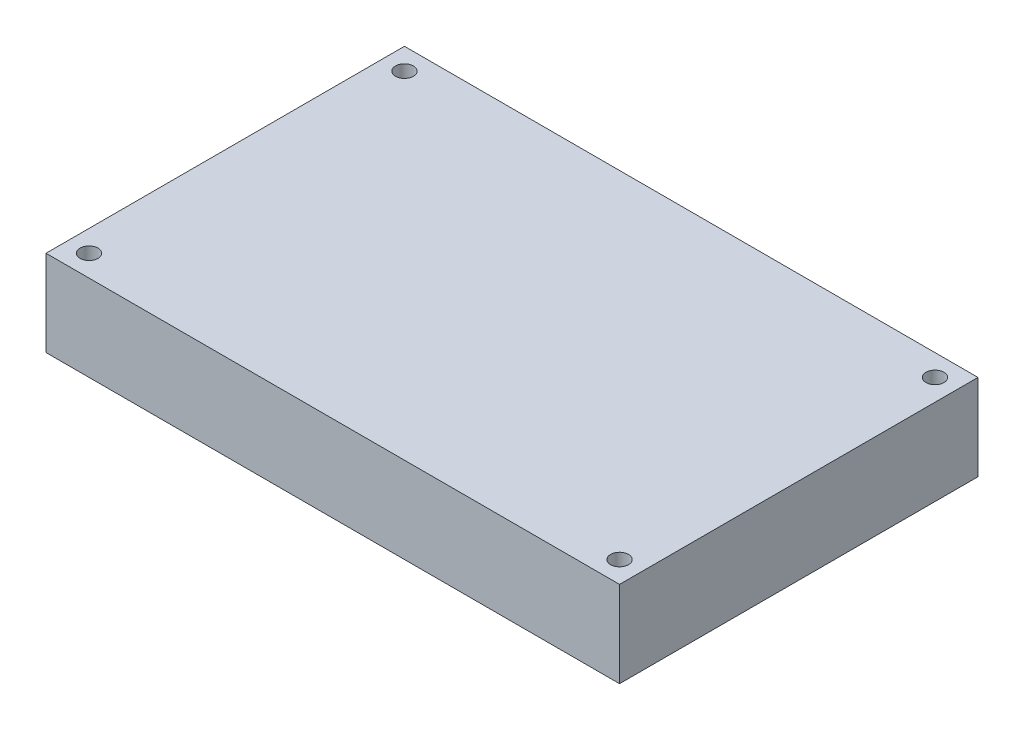
ISO-10303-21;
HEADER;
FILE_DESCRIPTION(('STEP AP214'),'2;1');
FILE_NAME('part.step','',(''),(''),'','','');
FILE_SCHEMA(('AUTOMOTIVE_DESIGN { 1 0 10303 214 1 1 1 1 }'));
ENDSEC;
DATA;
#1=APPLICATION_CONTEXT('core data for automotive mechanical design processes');
#2=APPLICATION_PROTOCOL_DEFINITION('international standard','automotive_design',2000,#1);
#3=PRODUCT_CONTEXT('',#1,'mechanical');
#4=PRODUCT('Part','Part','',(#3));
#5=PRODUCT_RELATED_PRODUCT_CATEGORY('part','',(#4));
#6=PRODUCT_DEFINITION_FORMATION('','',#4);
#7=PRODUCT_DEFINITION_CONTEXT('part definition',#1,'design');
#8=PRODUCT_DEFINITION('design','',#6,#7);
#9=PRODUCT_DEFINITION_SHAPE('','',#8);
#10=(LENGTH_UNIT() NAMED_UNIT(*) SI_UNIT(.MILLI.,.METRE.));
#11=(NAMED_UNIT(*) PLANE_ANGLE_UNIT() SI_UNIT($,.RADIAN.));
#12=(NAMED_UNIT(*) SI_UNIT($,.STERADIAN.) SOLID_ANGLE_UNIT());
#13=UNCERTAINTY_MEASURE_WITH_UNIT(LENGTH_MEASURE(1.E-05),#10,'distance_accuracy_value','');
#14=(GEOMETRIC_REPRESENTATION_CONTEXT(3) GLOBAL_UNCERTAINTY_ASSIGNED_CONTEXT((#13)) GLOBAL_UNIT_ASSIGNED_CONTEXT((#10,
#11,#12)) REPRESENTATION_CONTEXT('',''));
#15=CARTESIAN_POINT('',(0.,0.,0.));
#16=DIRECTION('',(0.,0.,1.));
#17=DIRECTION('',(1.,0.,0.));
#18=AXIS2_PLACEMENT_3D('',#15,#16,#17);
#19=CARTESIAN_POINT('',(0.,12.,0.));
#20=DIRECTION('',(0.,1.,0.));
#21=DIRECTION('',(0.,0.,1.));
#22=AXIS2_PLACEMENT_3D('',#19,#20,#21);
#23=PLANE('',#22);
#24=CARTESIAN_POINT('',(37.,12.,22.));
#25=DIRECTION('',(0.,1.,0.));
#26=DIRECTION('',(0.,0.,1.));
#27=AXIS2_PLACEMENT_3D('',#24,#25,#26);
#28=CIRCLE('',#27,1.25);
#29=CARTESIAN_POINT('',(37.,12.,23.25));
#30=VERTEX_POINT('',#29);
#31=EDGE_CURVE('E156',#30,#30,#28,.T.);
#32=ORIENTED_EDGE('',*,*,#31,.F.);
#33=EDGE_LOOP('',(#32));
#34=FACE_BOUND('',#33,.T.);
#35=CARTESIAN_POINT('',(-37.,12.,-22.));
#36=DIRECTION('',(0.,1.,0.));
#37=DIRECTION('',(0.,0.,1.));
#38=AXIS2_PLACEMENT_3D('',#35,#36,#37);
#39=CIRCLE('',#38,1.25);
#40=CARTESIAN_POINT('',(-37.,12.,-20.75));
#41=VERTEX_POINT('',#40);
#42=EDGE_CURVE('E125',#41,#41,#39,.T.);
#43=ORIENTED_EDGE('',*,*,#42,.F.);
#44=EDGE_LOOP('',(#43));
#45=FACE_BOUND('',#44,.T.);
#46=DIRECTION('',(0.,0.,-1.));
#47=VECTOR('',#46,1.);
#48=CARTESIAN_POINT('',(40.,12.,-25.));
#49=LINE('',#48,#47);
#50=CARTESIAN_POINT('',(40.,12.,25.));
#51=VERTEX_POINT('',#50);
#52=CARTESIAN_POINT('',(40.,12.,-25.));
#53=VERTEX_POINT('',#52);
#54=EDGE_CURVE('E104',#51,#53,#49,.T.);
#55=ORIENTED_EDGE('',*,*,#54,.T.);
#56=DIRECTION('',(-1.,0.,0.));
#57=VECTOR('',#56,1.);
#58=CARTESIAN_POINT('',(-40.,12.,-25.));
#59=LINE('',#58,#57);
#60=CARTESIAN_POINT('',(-40.,12.,-25.));
#61=VERTEX_POINT('',#60);
#62=EDGE_CURVE('E99',#53,#61,#59,.T.);
#63=ORIENTED_EDGE('',*,*,#62,.T.);
#64=DIRECTION('',(0.,0.,1.));
#65=VECTOR('',#64,1.);
#66=CARTESIAN_POINT('',(-40.,12.,-25.));
#67=LINE('',#66,#65);
#68=CARTESIAN_POINT('',(-40.,12.,25.));
#69=VERTEX_POINT('',#68);
#70=EDGE_CURVE('E102',#61,#69,#67,.T.);
#71=ORIENTED_EDGE('',*,*,#70,.T.);
#72=DIRECTION('',(1.,0.,0.));
#73=VECTOR('',#72,1.);
#74=CARTESIAN_POINT('',(-40.,12.,25.));
#75=LINE('',#74,#73);
#76=EDGE_CURVE('E64',#69,#51,#75,.T.);
#77=ORIENTED_EDGE('',*,*,#76,.T.);
#78=EDGE_LOOP('',(#55,#63,#71,#77));
#79=FACE_BOUND('',#78,.T.);
#80=CARTESIAN_POINT('',(37.,12.,-22.));
#81=DIRECTION('',(0.,1.,0.));
#82=DIRECTION('',(0.,0.,1.));
#83=AXIS2_PLACEMENT_3D('',#80,#81,#82);
#84=CIRCLE('',#83,1.25);
#85=CARTESIAN_POINT('',(37.,12.,-20.75));
#86=VERTEX_POINT('',#85);
#87=EDGE_CURVE('E149',#86,#86,#84,.T.);
#88=ORIENTED_EDGE('',*,*,#87,.F.);
#89=EDGE_LOOP('',(#88));
#90=FACE_BOUND('',#89,.T.);
#91=CARTESIAN_POINT('',(-37.,12.,22.));
#92=DIRECTION('',(0.,1.,0.));
#93=DIRECTION('',(0.,0.,1.));
#94=AXIS2_PLACEMENT_3D('',#91,#92,#93);
#95=CIRCLE('',#94,1.25);
#96=CARTESIAN_POINT('',(-37.,12.,23.25));
#97=VERTEX_POINT('',#96);
#98=EDGE_CURVE('E163',#97,#97,#95,.T.);
#99=ORIENTED_EDGE('',*,*,#98,.F.);
#100=EDGE_LOOP('',(#99));
#101=FACE_BOUND('',#100,.T.);
#102=ADVANCED_FACE('F43',(#34,#45,#79,#90,#101),#23,.T.);
#103=CARTESIAN_POINT('',(0.,0.,0.));
#104=DIRECTION('',(0.,1.,0.));
#105=DIRECTION('',(0.,0.,1.));
#106=AXIS2_PLACEMENT_3D('',#103,#104,#105);
#107=PLANE('',#106);
#108=DIRECTION('',(0.,0.,-1.));
#109=VECTOR('',#108,1.);
#110=CARTESIAN_POINT('',(40.,0.,-25.));
#111=LINE('',#110,#109);
#112=CARTESIAN_POINT('',(40.,0.,25.));
#113=VERTEX_POINT('',#112);
#114=CARTESIAN_POINT('',(40.,0.,-25.));
#115=VERTEX_POINT('',#114);
#116=EDGE_CURVE('E121',#113,#115,#111,.T.);
#117=ORIENTED_EDGE('',*,*,#116,.F.);
#118=DIRECTION('',(1.,0.,0.));
#119=VECTOR('',#118,1.);
#120=CARTESIAN_POINT('',(-40.,0.,25.));
#121=LINE('',#120,#119);
#122=CARTESIAN_POINT('',(-40.,0.,25.));
#123=VERTEX_POINT('',#122);
#124=EDGE_CURVE('E91',#123,#113,#121,.T.);
#125=ORIENTED_EDGE('',*,*,#124,.F.);
#126=DIRECTION('',(0.,0.,1.));
#127=VECTOR('',#126,1.);
#128=CARTESIAN_POINT('',(-40.,0.,-25.));
#129=LINE('',#128,#127);
#130=CARTESIAN_POINT('',(-40.,0.,-25.));
#131=VERTEX_POINT('',#130);
#132=EDGE_CURVE('E84',#131,#123,#129,.T.);
#133=ORIENTED_EDGE('',*,*,#132,.F.);
#134=DIRECTION('',(-1.,0.,0.));
#135=VECTOR('',#134,1.);
#136=CARTESIAN_POINT('',(-40.,0.,-25.));
#137=LINE('',#136,#135);
#138=EDGE_CURVE('E109',#115,#131,#137,.T.);
#139=ORIENTED_EDGE('',*,*,#138,.F.);
#140=EDGE_LOOP('',(#117,#125,#133,#139));
#141=FACE_BOUND('',#140,.T.);
#142=CARTESIAN_POINT('',(-37.,0.,-22.));
#143=DIRECTION('',(0.,1.,0.));
#144=DIRECTION('',(0.,0.,1.));
#145=AXIS2_PLACEMENT_3D('',#142,#143,#144);
#146=CIRCLE('',#145,1.25);
#147=CARTESIAN_POINT('',(-37.,0.,-20.75));
#148=VERTEX_POINT('',#147);
#149=EDGE_CURVE('E145',#148,#148,#146,.T.);
#150=ORIENTED_EDGE('',*,*,#149,.T.);
#151=EDGE_LOOP('',(#150));
#152=FACE_BOUND('',#151,.T.);
#153=CARTESIAN_POINT('',(37.,0.,-22.));
#154=DIRECTION('',(0.,1.,0.));
#155=DIRECTION('',(0.,0.,1.));
#156=AXIS2_PLACEMENT_3D('',#153,#154,#155);
#157=CIRCLE('',#156,1.25);
#158=CARTESIAN_POINT('',(37.,0.,-20.75));
#159=VERTEX_POINT('',#158);
#160=EDGE_CURVE('E153',#159,#159,#157,.T.);
#161=ORIENTED_EDGE('',*,*,#160,.T.);
#162=EDGE_LOOP('',(#161));
#163=FACE_BOUND('',#162,.T.);
#164=CARTESIAN_POINT('',(37.,0.,22.));
#165=DIRECTION('',(0.,1.,0.));
#166=DIRECTION('',(0.,0.,1.));
#167=AXIS2_PLACEMENT_3D('',#164,#165,#166);
#168=CIRCLE('',#167,1.25);
#169=CARTESIAN_POINT('',(37.,0.,23.25));
#170=VERTEX_POINT('',#169);
#171=EDGE_CURVE('E160',#170,#170,#168,.T.);
#172=ORIENTED_EDGE('',*,*,#171,.T.);
#173=EDGE_LOOP('',(#172));
#174=FACE_BOUND('',#173,.T.);
#175=CARTESIAN_POINT('',(-37.,0.,22.));
#176=DIRECTION('',(0.,1.,0.));
#177=DIRECTION('',(0.,0.,1.));
#178=AXIS2_PLACEMENT_3D('',#175,#176,#177);
#179=CIRCLE('',#178,1.25);
#180=CARTESIAN_POINT('',(-37.,0.,23.25));
#181=VERTEX_POINT('',#180);
#182=EDGE_CURVE('E167',#181,#181,#179,.T.);
#183=ORIENTED_EDGE('',*,*,#182,.T.);
#184=EDGE_LOOP('',(#183));
#185=FACE_BOUND('',#184,.T.);
#186=ADVANCED_FACE('F139',(#141,#152,#163,#174,#185),#107,.F.);
#187=CARTESIAN_POINT('',(40.,12.,-25.));
#188=DIRECTION('',(-1.,0.,0.));
#189=DIRECTION('',(0.,0.,1.));
#190=AXIS2_PLACEMENT_3D('',#187,#188,#189);
#191=PLANE('',#190);
#192=ORIENTED_EDGE('',*,*,#116,.T.);
#193=DIRECTION('',(0.,-1.,0.));
#194=VECTOR('',#193,1.);
#195=CARTESIAN_POINT('',(40.,12.,-25.));
#196=LINE('',#195,#194);
#197=EDGE_CURVE('E11',#53,#115,#196,.T.);
#198=ORIENTED_EDGE('',*,*,#197,.F.);
#199=ORIENTED_EDGE('',*,*,#54,.F.);
#200=DIRECTION('',(0.,-1.,0.));
#201=VECTOR('',#200,1.);
#202=CARTESIAN_POINT('',(40.,12.,25.));
#203=LINE('',#202,#201);
#204=EDGE_CURVE('E117',#51,#113,#203,.T.);
#205=ORIENTED_EDGE('',*,*,#204,.T.);
#206=EDGE_LOOP('',(#192,#198,#199,#205));
#207=FACE_BOUND('',#206,.T.);
#208=ADVANCED_FACE('F45',(#207),#191,.F.);
#209=CARTESIAN_POINT('',(-40.,12.,-25.));
#210=DIRECTION('',(0.,0.,1.));
#211=DIRECTION('',(1.,0.,0.));
#212=AXIS2_PLACEMENT_3D('',#209,#210,#211);
#213=PLANE('',#212);
#214=ORIENTED_EDGE('',*,*,#138,.T.);
#215=DIRECTION('',(0.,-1.,0.));
#216=VECTOR('',#215,1.);
#217=CARTESIAN_POINT('',(-40.,12.,-25.));
#218=LINE('',#217,#216);
#219=EDGE_CURVE('E53',#61,#131,#218,.T.);
#220=ORIENTED_EDGE('',*,*,#219,.F.);
#221=ORIENTED_EDGE('',*,*,#62,.F.);
#222=ORIENTED_EDGE('',*,*,#197,.T.);
#223=EDGE_LOOP('',(#214,#220,#221,#222));
#224=FACE_BOUND('',#223,.T.);
#225=ADVANCED_FACE('F108',(#224),#213,.F.);
#226=CARTESIAN_POINT('',(-40.,12.,-25.));
#227=DIRECTION('',(1.,0.,0.));
#228=DIRECTION('',(0.,0.,-1.));
#229=AXIS2_PLACEMENT_3D('',#226,#227,#228);
#230=PLANE('',#229);
#231=ORIENTED_EDGE('',*,*,#132,.T.);
#232=DIRECTION('',(0.,-1.,0.));
#233=VECTOR('',#232,1.);
#234=CARTESIAN_POINT('',(-40.,12.,25.));
#235=LINE('',#234,#233);
#236=EDGE_CURVE('E111',#69,#123,#235,.T.);
#237=ORIENTED_EDGE('',*,*,#236,.F.);
#238=ORIENTED_EDGE('',*,*,#70,.F.);
#239=ORIENTED_EDGE('',*,*,#219,.T.);
#240=EDGE_LOOP('',(#231,#237,#238,#239));
#241=FACE_BOUND('',#240,.T.);
#242=ADVANCED_FACE('F112',(#241),#230,.F.);
#243=CARTESIAN_POINT('',(-40.,12.,25.));
#244=DIRECTION('',(0.,0.,-1.));
#245=DIRECTION('',(-1.,0.,0.));
#246=AXIS2_PLACEMENT_3D('',#243,#244,#245);
#247=PLANE('',#246);
#248=ORIENTED_EDGE('',*,*,#124,.T.);
#249=ORIENTED_EDGE('',*,*,#204,.F.);
#250=ORIENTED_EDGE('',*,*,#76,.F.);
#251=ORIENTED_EDGE('',*,*,#236,.T.);
#252=EDGE_LOOP('',(#248,#249,#250,#251));
#253=FACE_BOUND('',#252,.T.);
#254=ADVANCED_FACE('F136',(#253),#247,.F.);
#255=CARTESIAN_POINT('',(-37.,12.,-22.));
#256=DIRECTION('',(0.,-1.,0.));
#257=DIRECTION('',(0.,0.,-1.));
#258=AXIS2_PLACEMENT_3D('',#255,#256,#257);
#259=CYLINDRICAL_SURFACE('',#258,1.25);
#260=ORIENTED_EDGE('',*,*,#42,.T.);
#261=EDGE_LOOP('',(#260));
#262=FACE_BOUND('',#261,.T.);
#263=ORIENTED_EDGE('',*,*,#149,.F.);
#264=EDGE_LOOP('',(#263));
#265=FACE_BOUND('',#264,.T.);
#266=ADVANCED_FACE('F187',(#262,#265),#259,.F.);
#267=CARTESIAN_POINT('',(37.,12.,-22.));
#268=DIRECTION('',(0.,-1.,0.));
#269=DIRECTION('',(0.,0.,-1.));
#270=AXIS2_PLACEMENT_3D('',#267,#268,#269);
#271=CYLINDRICAL_SURFACE('',#270,1.25);
#272=ORIENTED_EDGE('',*,*,#87,.T.);
#273=EDGE_LOOP('',(#272));
#274=FACE_BOUND('',#273,.T.);
#275=ORIENTED_EDGE('',*,*,#160,.F.);
#276=EDGE_LOOP('',(#275));
#277=FACE_BOUND('',#276,.T.);
#278=ADVANCED_FACE('F222',(#274,#277),#271,.F.);
#279=CARTESIAN_POINT('',(37.,12.,22.));
#280=DIRECTION('',(0.,-1.,0.));
#281=DIRECTION('',(0.,0.,-1.));
#282=AXIS2_PLACEMENT_3D('',#279,#280,#281);
#283=CYLINDRICAL_SURFACE('',#282,1.25);
#284=ORIENTED_EDGE('',*,*,#31,.T.);
#285=EDGE_LOOP('',(#284));
#286=FACE_BOUND('',#285,.T.);
#287=ORIENTED_EDGE('',*,*,#171,.F.);
#288=EDGE_LOOP('',(#287));
#289=FACE_BOUND('',#288,.T.);
#290=ADVANCED_FACE('F229',(#286,#289),#283,.F.);
#291=CARTESIAN_POINT('',(-37.,12.,22.));
#292=DIRECTION('',(0.,-1.,0.));
#293=DIRECTION('',(0.,0.,-1.));
#294=AXIS2_PLACEMENT_3D('',#291,#292,#293);
#295=CYLINDRICAL_SURFACE('',#294,1.25);
#296=ORIENTED_EDGE('',*,*,#98,.T.);
#297=EDGE_LOOP('',(#296));
#298=FACE_BOUND('',#297,.T.);
#299=ORIENTED_EDGE('',*,*,#182,.F.);
#300=EDGE_LOOP('',(#299));
#301=FACE_BOUND('',#300,.T.);
#302=ADVANCED_FACE('F174',(#298,#301),#295,.F.);
#303=CLOSED_SHELL('',(#102,#186,#208,#225,#242,#254,#266,#278,#290,#302));
#304=MANIFOLD_SOLID_BREP('B2',#303);
#305=ADVANCED_BREP_SHAPE_REPRESENTATION('',(#18,#304),#14);
#306=SHAPE_DEFINITION_REPRESENTATION(#9,#305);
ENDSEC;
END-ISO-10303-21;
